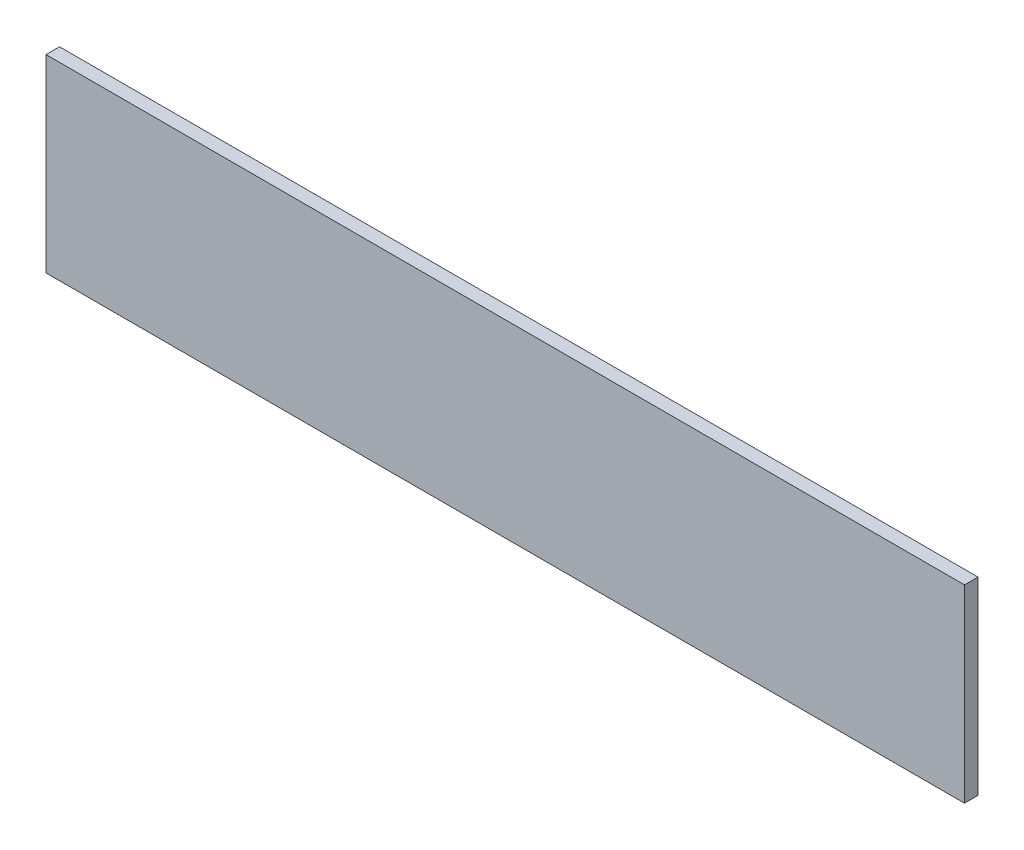
ISO-10303-21;
HEADER;
FILE_DESCRIPTION(('STEP AP214'),'2;1');
FILE_NAME('part.step','',(''),(''),'','','');
FILE_SCHEMA(('AUTOMOTIVE_DESIGN { 1 0 10303 214 1 1 1 1 }'));
ENDSEC;
DATA;
#1=APPLICATION_CONTEXT('core data for automotive mechanical design processes');
#2=APPLICATION_PROTOCOL_DEFINITION('international standard','automotive_design',2000,#1);
#3=PRODUCT_CONTEXT('',#1,'mechanical');
#4=PRODUCT('Part','Part','',(#3));
#5=PRODUCT_RELATED_PRODUCT_CATEGORY('part','',(#4));
#6=PRODUCT_DEFINITION_FORMATION('','',#4);
#7=PRODUCT_DEFINITION_CONTEXT('part definition',#1,'design');
#8=PRODUCT_DEFINITION('design','',#6,#7);
#9=PRODUCT_DEFINITION_SHAPE('','',#8);
#10=(LENGTH_UNIT() NAMED_UNIT(*) SI_UNIT(.MILLI.,.METRE.));
#11=(NAMED_UNIT(*) PLANE_ANGLE_UNIT() SI_UNIT($,.RADIAN.));
#12=(NAMED_UNIT(*) SI_UNIT($,.STERADIAN.) SOLID_ANGLE_UNIT());
#13=UNCERTAINTY_MEASURE_WITH_UNIT(LENGTH_MEASURE(1.E-05),#10,'distance_accuracy_value','');
#14=(GEOMETRIC_REPRESENTATION_CONTEXT(3) GLOBAL_UNCERTAINTY_ASSIGNED_CONTEXT((#13)) GLOBAL_UNIT_ASSIGNED_CONTEXT((#10,
#11,#12)) REPRESENTATION_CONTEXT('',''));
#15=CARTESIAN_POINT('',(0.,0.,0.));
#16=DIRECTION('',(0.,0.,1.));
#17=DIRECTION('',(1.,0.,0.));
#18=AXIS2_PLACEMENT_3D('',#15,#16,#17);
#19=CARTESIAN_POINT('',(0.,0.,0.));
#20=DIRECTION('',(0.,0.,-1.));
#21=DIRECTION('',(-1.,0.,0.));
#22=AXIS2_PLACEMENT_3D('',#19,#20,#21);
#23=PLANE('',#22);
#24=CARTESIAN_POINT('',(-319.0875,-82.55,0.));
#25=DIRECTION('',(0.,0.,-1.));
#26=DIRECTION('',(-1.,0.,0.));
#27=AXIS2_PLACEMENT_3D('',#24,#25,#26);
#28=CIRCLE('',#27,3.17499999999997);
#29=CARTESIAN_POINT('',(-322.2625,-82.55,0.));
#30=VERTEX_POINT('',#29);
#31=EDGE_CURVE('E195',#30,#30,#28,.T.);
#32=ORIENTED_EDGE('',*,*,#31,.F.);
#33=EDGE_LOOP('',(#32));
#34=FACE_BOUND('',#33,.T.);
#35=CARTESIAN_POINT('',(-106.3625,-82.55,0.));
#36=DIRECTION('',(0.,0.,-1.));
#37=DIRECTION('',(-1.,0.,0.));
#38=AXIS2_PLACEMENT_3D('',#35,#36,#37);
#39=CIRCLE('',#38,3.17499999999997);
#40=CARTESIAN_POINT('',(-109.5375,-82.55,0.));
#41=VERTEX_POINT('',#40);
#42=EDGE_CURVE('E189',#41,#41,#39,.T.);
#43=ORIENTED_EDGE('',*,*,#42,.F.);
#44=EDGE_LOOP('',(#43));
#45=FACE_BOUND('',#44,.T.);
#46=CARTESIAN_POINT('',(106.3625,-82.55,0.));
#47=DIRECTION('',(0.,0.,-1.));
#48=DIRECTION('',(-1.,0.,0.));
#49=AXIS2_PLACEMENT_3D('',#46,#47,#48);
#50=CIRCLE('',#49,3.17499999999997);
#51=CARTESIAN_POINT('',(103.1875,-82.55,0.));
#52=VERTEX_POINT('',#51);
#53=EDGE_CURVE('E183',#52,#52,#50,.T.);
#54=ORIENTED_EDGE('',*,*,#53,.F.);
#55=EDGE_LOOP('',(#54));
#56=FACE_BOUND('',#55,.T.);
#57=CARTESIAN_POINT('',(319.0875,-82.55,0.));
#58=DIRECTION('',(0.,0.,-1.));
#59=DIRECTION('',(-1.,0.,0.));
#60=AXIS2_PLACEMENT_3D('',#57,#58,#59);
#61=CIRCLE('',#60,3.17499999999997);
#62=CARTESIAN_POINT('',(315.9125,-82.55,0.));
#63=VERTEX_POINT('',#62);
#64=EDGE_CURVE('E177',#63,#63,#61,.T.);
#65=ORIENTED_EDGE('',*,*,#64,.F.);
#66=EDGE_LOOP('',(#65));
#67=FACE_BOUND('',#66,.T.);
#68=CARTESIAN_POINT('',(-425.45,-82.55,0.));
#69=DIRECTION('',(0.,0.,-1.));
#70=DIRECTION('',(-1.,0.,0.));
#71=AXIS2_PLACEMENT_3D('',#68,#69,#70);
#72=CIRCLE('',#71,2.50000000000002);
#73=CARTESIAN_POINT('',(-427.95,-82.55,0.));
#74=VERTEX_POINT('',#73);
#75=EDGE_CURVE('E171',#74,#74,#72,.T.);
#76=ORIENTED_EDGE('',*,*,#75,.F.);
#77=EDGE_LOOP('',(#76));
#78=FACE_BOUND('',#77,.T.);
#79=CARTESIAN_POINT('',(-212.725,-82.55,0.));
#80=DIRECTION('',(0.,0.,-1.));
#81=DIRECTION('',(-1.,0.,0.));
#82=AXIS2_PLACEMENT_3D('',#79,#80,#81);
#83=CIRCLE('',#82,2.50000000000002);
#84=CARTESIAN_POINT('',(-215.225,-82.55,0.));
#85=VERTEX_POINT('',#84);
#86=EDGE_CURVE('E165',#85,#85,#83,.T.);
#87=ORIENTED_EDGE('',*,*,#86,.F.);
#88=EDGE_LOOP('',(#87));
#89=FACE_BOUND('',#88,.T.);
#90=CARTESIAN_POINT('',(-1.66533453693773E-13,-82.55,0.));
#91=DIRECTION('',(0.,0.,-1.));
#92=DIRECTION('',(-1.,0.,0.));
#93=AXIS2_PLACEMENT_3D('',#90,#91,#92);
#94=CIRCLE('',#93,2.50000000000002);
#95=CARTESIAN_POINT('',(-2.50000000000019,-82.55,0.));
#96=VERTEX_POINT('',#95);
#97=EDGE_CURVE('E159',#96,#96,#94,.T.);
#98=ORIENTED_EDGE('',*,*,#97,.F.);
#99=EDGE_LOOP('',(#98));
#100=FACE_BOUND('',#99,.T.);
#101=CARTESIAN_POINT('',(212.725,-82.55,0.));
#102=DIRECTION('',(0.,0.,-1.));
#103=DIRECTION('',(-1.,0.,0.));
#104=AXIS2_PLACEMENT_3D('',#101,#102,#103);
#105=CIRCLE('',#104,2.50000000000002);
#106=CARTESIAN_POINT('',(210.225,-82.55,0.));
#107=VERTEX_POINT('',#106);
#108=EDGE_CURVE('E153',#107,#107,#105,.T.);
#109=ORIENTED_EDGE('',*,*,#108,.F.);
#110=EDGE_LOOP('',(#109));
#111=FACE_BOUND('',#110,.T.);
#112=CARTESIAN_POINT('',(425.45,-82.55,0.));
#113=DIRECTION('',(0.,0.,-1.));
#114=DIRECTION('',(-1.,0.,0.));
#115=AXIS2_PLACEMENT_3D('',#112,#113,#114);
#116=CIRCLE('',#115,2.50000000000002);
#117=CARTESIAN_POINT('',(422.95,-82.55,0.));
#118=VERTEX_POINT('',#117);
#119=EDGE_CURVE('E147',#118,#118,#116,.T.);
#120=ORIENTED_EDGE('',*,*,#119,.F.);
#121=EDGE_LOOP('',(#120));
#122=FACE_BOUND('',#121,.T.);
#123=CARTESIAN_POINT('',(425.45,-44.4499999999999,0.));
#124=DIRECTION('',(0.,0.,-1.));
#125=DIRECTION('',(1.,0.,0.));
#126=AXIS2_PLACEMENT_3D('',#123,#124,#125);
#127=CIRCLE('',#126,2.50000000000002);
#128=CARTESIAN_POINT('',(427.95,-44.4499999999999,0.));
#129=VERTEX_POINT('',#128);
#130=EDGE_CURVE('E141',#129,#129,#127,.T.);
#131=ORIENTED_EDGE('',*,*,#130,.F.);
#132=EDGE_LOOP('',(#131));
#133=FACE_BOUND('',#132,.T.);
#134=CARTESIAN_POINT('',(-425.45,-44.4499999999998,0.));
#135=DIRECTION('',(0.,0.,-1.));
#136=DIRECTION('',(-1.,0.,0.));
#137=AXIS2_PLACEMENT_3D('',#134,#135,#136);
#138=CIRCLE('',#137,2.50000000000002);
#139=CARTESIAN_POINT('',(-427.95,-44.4499999999998,0.));
#140=VERTEX_POINT('',#139);
#141=EDGE_CURVE('E135',#140,#140,#138,.T.);
#142=ORIENTED_EDGE('',*,*,#141,.F.);
#143=EDGE_LOOP('',(#142));
#144=FACE_BOUND('',#143,.T.);
#145=CARTESIAN_POINT('',(-425.45,44.4500000000001,0.));
#146=DIRECTION('',(0.,0.,-1.));
#147=DIRECTION('',(1.,0.,0.));
#148=AXIS2_PLACEMENT_3D('',#145,#146,#147);
#149=CIRCLE('',#148,2.50000000000002);
#150=CARTESIAN_POINT('',(-422.95,44.4500000000001,0.));
#151=VERTEX_POINT('',#150);
#152=EDGE_CURVE('E129',#151,#151,#149,.T.);
#153=ORIENTED_EDGE('',*,*,#152,.F.);
#154=EDGE_LOOP('',(#153));
#155=FACE_BOUND('',#154,.T.);
#156=CARTESIAN_POINT('',(425.45,44.4499999999999,0.));
#157=DIRECTION('',(0.,0.,-1.));
#158=DIRECTION('',(-1.,0.,0.));
#159=AXIS2_PLACEMENT_3D('',#156,#157,#158);
#160=CIRCLE('',#159,2.50000000000002);
#161=CARTESIAN_POINT('',(422.95,44.4499999999999,0.));
#162=VERTEX_POINT('',#161);
#163=EDGE_CURVE('E123',#162,#162,#160,.T.);
#164=ORIENTED_EDGE('',*,*,#163,.F.);
#165=EDGE_LOOP('',(#164));
#166=FACE_BOUND('',#165,.T.);
#167=CARTESIAN_POINT('',(-425.45,0.,0.));
#168=DIRECTION('',(0.,0.,1.));
#169=DIRECTION('',(1.,0.,0.));
#170=AXIS2_PLACEMENT_3D('',#167,#168,#169);
#171=CIRCLE('',#170,3.17499999999997);
#172=CARTESIAN_POINT('',(-422.275,0.,0.));
#173=VERTEX_POINT('',#172);
#174=EDGE_CURVE('E111',#173,#173,#171,.T.);
#175=ORIENTED_EDGE('',*,*,#174,.T.);
#176=EDGE_LOOP('',(#175));
#177=FACE_BOUND('',#176,.T.);
#178=DIRECTION('',(0.,1.,0.));
#179=VECTOR('',#178,1.);
#180=CARTESIAN_POINT('',(431.8,-88.9,0.));
#181=LINE('',#180,#179);
#182=CARTESIAN_POINT('',(431.8,-88.9,0.));
#183=VERTEX_POINT('',#182);
#184=CARTESIAN_POINT('',(431.8,88.9,0.));
#185=VERTEX_POINT('',#184);
#186=EDGE_CURVE('E97',#183,#185,#181,.T.);
#187=ORIENTED_EDGE('',*,*,#186,.F.);
#188=DIRECTION('',(1.,0.,0.));
#189=VECTOR('',#188,1.);
#190=CARTESIAN_POINT('',(-431.8,-88.9,0.));
#191=LINE('',#190,#189);
#192=CARTESIAN_POINT('',(-431.8,-88.9,0.));
#193=VERTEX_POINT('',#192);
#194=EDGE_CURVE('E73',#193,#183,#191,.T.);
#195=ORIENTED_EDGE('',*,*,#194,.F.);
#196=DIRECTION('',(0.,-1.,0.));
#197=VECTOR('',#196,1.);
#198=CARTESIAN_POINT('',(-431.8,-88.9,0.));
#199=LINE('',#198,#197);
#200=CARTESIAN_POINT('',(-431.8,88.9,0.));
#201=VERTEX_POINT('',#200);
#202=EDGE_CURVE('E67',#201,#193,#199,.T.);
#203=ORIENTED_EDGE('',*,*,#202,.F.);
#204=DIRECTION('',(-1.,0.,0.));
#205=VECTOR('',#204,1.);
#206=CARTESIAN_POINT('',(-431.8,88.9,0.));
#207=LINE('',#206,#205);
#208=EDGE_CURVE('E89',#185,#201,#207,.T.);
#209=ORIENTED_EDGE('',*,*,#208,.F.);
#210=EDGE_LOOP('',(#187,#195,#203,#209));
#211=FACE_BOUND('',#210,.T.);
#212=CARTESIAN_POINT('',(425.45,0.,0.));
#213=DIRECTION('',(0.,0.,1.));
#214=DIRECTION('',(-1.,0.,0.));
#215=AXIS2_PLACEMENT_3D('',#212,#213,#214);
#216=CIRCLE('',#215,3.17499999999997);
#217=CARTESIAN_POINT('',(422.275,0.,0.));
#218=VERTEX_POINT('',#217);
#219=EDGE_CURVE('E117',#218,#218,#216,.T.);
#220=ORIENTED_EDGE('',*,*,#219,.T.);
#221=EDGE_LOOP('',(#220));
#222=FACE_BOUND('',#221,.T.);
#223=ADVANCED_FACE('F33',(#34,#45,#56,#67,#78,#89,#100,#111,#122,#133,#144,#155,#166,#177,#211,
#222),#23,.T.);
#224=CARTESIAN_POINT('',(431.8,-88.9,12.7));
#225=DIRECTION('',(-1.,0.,0.));
#226=DIRECTION('',(0.,0.,1.));
#227=AXIS2_PLACEMENT_3D('',#224,#225,#226);
#228=PLANE('',#227);
#229=ORIENTED_EDGE('',*,*,#186,.T.);
#230=DIRECTION('',(0.,0.,-1.));
#231=VECTOR('',#230,1.);
#232=CARTESIAN_POINT('',(431.8,88.9,12.7));
#233=LINE('',#232,#231);
#234=CARTESIAN_POINT('',(431.8,88.9,12.7));
#235=VERTEX_POINT('',#234);
#236=EDGE_CURVE('E11',#235,#185,#233,.T.);
#237=ORIENTED_EDGE('',*,*,#236,.F.);
#238=DIRECTION('',(0.,1.,0.));
#239=VECTOR('',#238,1.);
#240=CARTESIAN_POINT('',(431.8,-88.9,12.7));
#241=LINE('',#240,#239);
#242=CARTESIAN_POINT('',(431.8,-88.9,12.7));
#243=VERTEX_POINT('',#242);
#244=EDGE_CURVE('E85',#243,#235,#241,.T.);
#245=ORIENTED_EDGE('',*,*,#244,.F.);
#246=DIRECTION('',(0.,0.,-1.));
#247=VECTOR('',#246,1.);
#248=CARTESIAN_POINT('',(431.8,-88.9,12.7));
#249=LINE('',#248,#247);
#250=EDGE_CURVE('E93',#243,#183,#249,.T.);
#251=ORIENTED_EDGE('',*,*,#250,.T.);
#252=EDGE_LOOP('',(#229,#237,#245,#251));
#253=FACE_BOUND('',#252,.T.);
#254=ADVANCED_FACE('F35',(#253),#228,.F.);
#255=CARTESIAN_POINT('',(-431.8,88.9,12.7));
#256=DIRECTION('',(0.,-1.,0.));
#257=DIRECTION('',(0.,0.,-1.));
#258=AXIS2_PLACEMENT_3D('',#255,#256,#257);
#259=PLANE('',#258);
#260=ORIENTED_EDGE('',*,*,#208,.T.);
#261=DIRECTION('',(0.,0.,-1.));
#262=VECTOR('',#261,1.);
#263=CARTESIAN_POINT('',(-431.8,88.9,12.7));
#264=LINE('',#263,#262);
#265=CARTESIAN_POINT('',(-431.8,88.9,12.7));
#266=VERTEX_POINT('',#265);
#267=EDGE_CURVE('E42',#266,#201,#264,.T.);
#268=ORIENTED_EDGE('',*,*,#267,.F.);
#269=DIRECTION('',(-1.,0.,0.));
#270=VECTOR('',#269,1.);
#271=CARTESIAN_POINT('',(-431.8,88.9,12.7));
#272=LINE('',#271,#270);
#273=EDGE_CURVE('E80',#235,#266,#272,.T.);
#274=ORIENTED_EDGE('',*,*,#273,.F.);
#275=ORIENTED_EDGE('',*,*,#236,.T.);
#276=EDGE_LOOP('',(#260,#268,#274,#275));
#277=FACE_BOUND('',#276,.T.);
#278=ADVANCED_FACE('F88',(#277),#259,.F.);
#279=CARTESIAN_POINT('',(-431.8,-88.9,12.7));
#280=DIRECTION('',(1.,0.,0.));
#281=DIRECTION('',(0.,0.,-1.));
#282=AXIS2_PLACEMENT_3D('',#279,#280,#281);
#283=PLANE('',#282);
#284=ORIENTED_EDGE('',*,*,#202,.T.);
#285=DIRECTION('',(0.,0.,-1.));
#286=VECTOR('',#285,1.);
#287=CARTESIAN_POINT('',(-431.8,-88.9,12.7));
#288=LINE('',#287,#286);
#289=CARTESIAN_POINT('',(-431.8,-88.9,12.7));
#290=VERTEX_POINT('',#289);
#291=EDGE_CURVE('E90',#290,#193,#288,.T.);
#292=ORIENTED_EDGE('',*,*,#291,.F.);
#293=DIRECTION('',(0.,-1.,0.));
#294=VECTOR('',#293,1.);
#295=CARTESIAN_POINT('',(-431.8,-88.9,12.7));
#296=LINE('',#295,#294);
#297=EDGE_CURVE('E83',#266,#290,#296,.T.);
#298=ORIENTED_EDGE('',*,*,#297,.F.);
#299=ORIENTED_EDGE('',*,*,#267,.T.);
#300=EDGE_LOOP('',(#284,#292,#298,#299));
#301=FACE_BOUND('',#300,.T.);
#302=ADVANCED_FACE('F91',(#301),#283,.F.);
#303=CARTESIAN_POINT('',(-431.8,-88.9,12.7));
#304=DIRECTION('',(0.,1.,0.));
#305=DIRECTION('',(0.,0.,1.));
#306=AXIS2_PLACEMENT_3D('',#303,#304,#305);
#307=PLANE('',#306);
#308=ORIENTED_EDGE('',*,*,#194,.T.);
#309=ORIENTED_EDGE('',*,*,#250,.F.);
#310=DIRECTION('',(1.,0.,0.));
#311=VECTOR('',#310,1.);
#312=CARTESIAN_POINT('',(-431.8,-88.9,12.7));
#313=LINE('',#312,#311);
#314=EDGE_CURVE('E50',#290,#243,#313,.T.);
#315=ORIENTED_EDGE('',*,*,#314,.F.);
#316=ORIENTED_EDGE('',*,*,#291,.T.);
#317=EDGE_LOOP('',(#308,#309,#315,#316));
#318=FACE_BOUND('',#317,.T.);
#319=ADVANCED_FACE('F105',(#318),#307,.F.);
#320=CARTESIAN_POINT('',(0.,0.,12.7));
#321=DIRECTION('',(0.,0.,-1.));
#322=DIRECTION('',(-1.,0.,0.));
#323=AXIS2_PLACEMENT_3D('',#320,#321,#322);
#324=PLANE('',#323);
#325=ORIENTED_EDGE('',*,*,#244,.T.);
#326=ORIENTED_EDGE('',*,*,#273,.T.);
#327=ORIENTED_EDGE('',*,*,#297,.T.);
#328=ORIENTED_EDGE('',*,*,#314,.T.);
#329=EDGE_LOOP('',(#325,#326,#327,#328));
#330=FACE_BOUND('',#329,.T.);
#331=ADVANCED_FACE('F81',(#330),#324,.F.);
#332=CARTESIAN_POINT('',(-425.45,0.,11.43));
#333=DIRECTION('',(0.,0.,-1.));
#334=DIRECTION('',(-1.,0.,0.));
#335=AXIS2_PLACEMENT_3D('',#332,#333,#334);
#336=CYLINDRICAL_SURFACE('',#335,3.17499999999997);
#337=CARTESIAN_POINT('',(-425.45,0.,11.43));
#338=DIRECTION('',(0.,0.,1.));
#339=DIRECTION('',(1.,0.,0.));
#340=AXIS2_PLACEMENT_3D('',#337,#338,#339);
#341=CIRCLE('',#340,3.17499999999997);
#342=CARTESIAN_POINT('',(-422.275,0.,11.43));
#343=VERTEX_POINT('',#342);
#344=EDGE_CURVE('E100',#343,#343,#341,.T.);
#345=ORIENTED_EDGE('',*,*,#344,.T.);
#346=EDGE_LOOP('',(#345));
#347=FACE_BOUND('',#346,.T.);
#348=ORIENTED_EDGE('',*,*,#174,.F.);
#349=EDGE_LOOP('',(#348));
#350=FACE_BOUND('',#349,.T.);
#351=ADVANCED_FACE('F239',(#347,#350),#336,.F.);
#352=CARTESIAN_POINT('',(-425.45,0.,11.43));
#353=DIRECTION('',(0.,0.,1.));
#354=DIRECTION('',(1.,0.,0.));
#355=AXIS2_PLACEMENT_3D('',#352,#353,#354);
#356=PLANE('',#355);
#357=ORIENTED_EDGE('',*,*,#344,.F.);
#358=EDGE_LOOP('',(#357));
#359=FACE_BOUND('',#358,.T.);
#360=ADVANCED_FACE('F241',(#359),#356,.F.);
#361=CARTESIAN_POINT('',(425.45,0.,11.43));
#362=DIRECTION('',(0.,0.,-1.));
#363=DIRECTION('',(-1.,0.,0.));
#364=AXIS2_PLACEMENT_3D('',#361,#362,#363);
#365=CYLINDRICAL_SURFACE('',#364,3.17499999999997);
#366=CARTESIAN_POINT('',(425.45,0.,11.43));
#367=DIRECTION('',(0.,0.,1.));
#368=DIRECTION('',(-1.,0.,0.));
#369=AXIS2_PLACEMENT_3D('',#366,#367,#368);
#370=CIRCLE('',#369,3.17499999999997);
#371=CARTESIAN_POINT('',(422.275,0.,11.43));
#372=VERTEX_POINT('',#371);
#373=EDGE_CURVE('E114',#372,#372,#370,.T.);
#374=ORIENTED_EDGE('',*,*,#373,.T.);
#375=EDGE_LOOP('',(#374));
#376=FACE_BOUND('',#375,.T.);
#377=ORIENTED_EDGE('',*,*,#219,.F.);
#378=EDGE_LOOP('',(#377));
#379=FACE_BOUND('',#378,.T.);
#380=ADVANCED_FACE('F248',(#376,#379),#365,.F.);
#381=CARTESIAN_POINT('',(425.45,0.,11.43));
#382=DIRECTION('',(0.,0.,-1.));
#383=DIRECTION('',(-1.,0.,0.));
#384=AXIS2_PLACEMENT_3D('',#381,#382,#383);
#385=PLANE('',#384);
#386=ORIENTED_EDGE('',*,*,#373,.F.);
#387=EDGE_LOOP('',(#386));
#388=FACE_BOUND('',#387,.T.);
#389=ADVANCED_FACE('F422',(#388),#385,.T.);
#390=CARTESIAN_POINT('',(425.45,44.4499999999999,8.));
#391=DIRECTION('',(0.,0.,-1.));
#392=DIRECTION('',(-1.,0.,0.));
#393=AXIS2_PLACEMENT_3D('',#390,#391,#392);
#394=CYLINDRICAL_SURFACE('',#393,2.50000000000002);
#395=CARTESIAN_POINT('',(425.45,44.4499999999999,8.));
#396=DIRECTION('',(0.,0.,-1.));
#397=DIRECTION('',(-1.,0.,0.));
#398=AXIS2_PLACEMENT_3D('',#395,#396,#397);
#399=CIRCLE('',#398,2.50000000000002);
#400=CARTESIAN_POINT('',(422.95,44.4499999999999,8.));
#401=VERTEX_POINT('',#400);
#402=EDGE_CURVE('E120',#401,#401,#399,.T.);
#403=ORIENTED_EDGE('',*,*,#402,.F.);
#404=EDGE_LOOP('',(#403));
#405=FACE_BOUND('',#404,.T.);
#406=ORIENTED_EDGE('',*,*,#163,.T.);
#407=EDGE_LOOP('',(#406));
#408=FACE_BOUND('',#407,.T.);
#409=ADVANCED_FACE('F418',(#405,#408),#394,.F.);
#410=CARTESIAN_POINT('',(425.45,44.4499999999999,8.));
#411=DIRECTION('',(0.,0.,-1.));
#412=DIRECTION('',(-1.,0.,0.));
#413=AXIS2_PLACEMENT_3D('',#410,#411,#412);
#414=PLANE('',#413);
#415=ORIENTED_EDGE('',*,*,#402,.T.);
#416=EDGE_LOOP('',(#415));
#417=FACE_BOUND('',#416,.T.);
#418=ADVANCED_FACE('F414',(#417),#414,.T.);
#419=CARTESIAN_POINT('',(-425.45,44.4500000000001,8.));
#420=DIRECTION('',(0.,0.,-1.));
#421=DIRECTION('',(-1.,0.,0.));
#422=AXIS2_PLACEMENT_3D('',#419,#420,#421);
#423=CYLINDRICAL_SURFACE('',#422,2.50000000000002);
#424=CARTESIAN_POINT('',(-425.45,44.4500000000001,8.));
#425=DIRECTION('',(0.,0.,-1.));
#426=DIRECTION('',(1.,0.,0.));
#427=AXIS2_PLACEMENT_3D('',#424,#425,#426);
#428=CIRCLE('',#427,2.50000000000002);
#429=CARTESIAN_POINT('',(-422.95,44.4500000000001,8.));
#430=VERTEX_POINT('',#429);
#431=EDGE_CURVE('E126',#430,#430,#428,.T.);
#432=ORIENTED_EDGE('',*,*,#431,.F.);
#433=EDGE_LOOP('',(#432));
#434=FACE_BOUND('',#433,.T.);
#435=ORIENTED_EDGE('',*,*,#152,.T.);
#436=EDGE_LOOP('',(#435));
#437=FACE_BOUND('',#436,.T.);
#438=ADVANCED_FACE('F410',(#434,#437),#423,.F.);
#439=CARTESIAN_POINT('',(-425.45,44.4500000000001,8.));
#440=DIRECTION('',(0.,0.,1.));
#441=DIRECTION('',(1.,0.,0.));
#442=AXIS2_PLACEMENT_3D('',#439,#440,#441);
#443=PLANE('',#442);
#444=ORIENTED_EDGE('',*,*,#431,.T.);
#445=EDGE_LOOP('',(#444));
#446=FACE_BOUND('',#445,.T.);
#447=ADVANCED_FACE('F406',(#446),#443,.F.);
#448=CARTESIAN_POINT('',(-425.45,-44.4499999999998,8.));
#449=DIRECTION('',(0.,0.,-1.));
#450=DIRECTION('',(-1.,0.,0.));
#451=AXIS2_PLACEMENT_3D('',#448,#449,#450);
#452=CYLINDRICAL_SURFACE('',#451,2.50000000000002);
#453=CARTESIAN_POINT('',(-425.45,-44.4499999999998,8.));
#454=DIRECTION('',(0.,0.,-1.));
#455=DIRECTION('',(-1.,0.,0.));
#456=AXIS2_PLACEMENT_3D('',#453,#454,#455);
#457=CIRCLE('',#456,2.50000000000002);
#458=CARTESIAN_POINT('',(-427.95,-44.4499999999998,8.));
#459=VERTEX_POINT('',#458);
#460=EDGE_CURVE('E132',#459,#459,#457,.T.);
#461=ORIENTED_EDGE('',*,*,#460,.F.);
#462=EDGE_LOOP('',(#461));
#463=FACE_BOUND('',#462,.T.);
#464=ORIENTED_EDGE('',*,*,#141,.T.);
#465=EDGE_LOOP('',(#464));
#466=FACE_BOUND('',#465,.T.);
#467=ADVANCED_FACE('F402',(#463,#466),#452,.F.);
#468=CARTESIAN_POINT('',(-425.45,-44.4499999999998,8.));
#469=DIRECTION('',(0.,0.,-1.));
#470=DIRECTION('',(-1.,0.,0.));
#471=AXIS2_PLACEMENT_3D('',#468,#469,#470);
#472=PLANE('',#471);
#473=ORIENTED_EDGE('',*,*,#460,.T.);
#474=EDGE_LOOP('',(#473));
#475=FACE_BOUND('',#474,.T.);
#476=ADVANCED_FACE('F398',(#475),#472,.T.);
#477=CARTESIAN_POINT('',(425.45,-44.4499999999999,8.));
#478=DIRECTION('',(0.,0.,-1.));
#479=DIRECTION('',(-1.,0.,0.));
#480=AXIS2_PLACEMENT_3D('',#477,#478,#479);
#481=CYLINDRICAL_SURFACE('',#480,2.50000000000002);
#482=CARTESIAN_POINT('',(425.45,-44.4499999999999,8.));
#483=DIRECTION('',(0.,0.,-1.));
#484=DIRECTION('',(1.,0.,0.));
#485=AXIS2_PLACEMENT_3D('',#482,#483,#484);
#486=CIRCLE('',#485,2.50000000000002);
#487=CARTESIAN_POINT('',(427.95,-44.4499999999999,8.));
#488=VERTEX_POINT('',#487);
#489=EDGE_CURVE('E138',#488,#488,#486,.T.);
#490=ORIENTED_EDGE('',*,*,#489,.F.);
#491=EDGE_LOOP('',(#490));
#492=FACE_BOUND('',#491,.T.);
#493=ORIENTED_EDGE('',*,*,#130,.T.);
#494=EDGE_LOOP('',(#493));
#495=FACE_BOUND('',#494,.T.);
#496=ADVANCED_FACE('F394',(#492,#495),#481,.F.);
#497=CARTESIAN_POINT('',(425.45,-44.4499999999999,8.));
#498=DIRECTION('',(0.,0.,1.));
#499=DIRECTION('',(1.,0.,0.));
#500=AXIS2_PLACEMENT_3D('',#497,#498,#499);
#501=PLANE('',#500);
#502=ORIENTED_EDGE('',*,*,#489,.T.);
#503=EDGE_LOOP('',(#502));
#504=FACE_BOUND('',#503,.T.);
#505=ADVANCED_FACE('F390',(#504),#501,.F.);
#506=CARTESIAN_POINT('',(425.45,-82.55,8.));
#507=DIRECTION('',(0.,0.,-1.));
#508=DIRECTION('',(-1.,0.,0.));
#509=AXIS2_PLACEMENT_3D('',#506,#507,#508);
#510=CYLINDRICAL_SURFACE('',#509,2.50000000000002);
#511=CARTESIAN_POINT('',(425.45,-82.55,8.));
#512=DIRECTION('',(0.,0.,-1.));
#513=DIRECTION('',(-1.,0.,0.));
#514=AXIS2_PLACEMENT_3D('',#511,#512,#513);
#515=CIRCLE('',#514,2.50000000000002);
#516=CARTESIAN_POINT('',(422.95,-82.55,8.));
#517=VERTEX_POINT('',#516);
#518=EDGE_CURVE('E144',#517,#517,#515,.T.);
#519=ORIENTED_EDGE('',*,*,#518,.F.);
#520=EDGE_LOOP('',(#519));
#521=FACE_BOUND('',#520,.T.);
#522=ORIENTED_EDGE('',*,*,#119,.T.);
#523=EDGE_LOOP('',(#522));
#524=FACE_BOUND('',#523,.T.);
#525=ADVANCED_FACE('F386',(#521,#524),#510,.F.);
#526=CARTESIAN_POINT('',(425.45,-82.55,8.));
#527=DIRECTION('',(0.,0.,-1.));
#528=DIRECTION('',(-1.,0.,0.));
#529=AXIS2_PLACEMENT_3D('',#526,#527,#528);
#530=PLANE('',#529);
#531=ORIENTED_EDGE('',*,*,#518,.T.);
#532=EDGE_LOOP('',(#531));
#533=FACE_BOUND('',#532,.T.);
#534=ADVANCED_FACE('F382',(#533),#530,.T.);
#535=CARTESIAN_POINT('',(212.725,-82.55,8.));
#536=DIRECTION('',(0.,0.,-1.));
#537=DIRECTION('',(-1.,0.,0.));
#538=AXIS2_PLACEMENT_3D('',#535,#536,#537);
#539=CYLINDRICAL_SURFACE('',#538,2.50000000000002);
#540=CARTESIAN_POINT('',(212.725,-82.55,8.));
#541=DIRECTION('',(0.,0.,-1.));
#542=DIRECTION('',(-1.,0.,0.));
#543=AXIS2_PLACEMENT_3D('',#540,#541,#542);
#544=CIRCLE('',#543,2.50000000000002);
#545=CARTESIAN_POINT('',(210.225,-82.55,8.));
#546=VERTEX_POINT('',#545);
#547=EDGE_CURVE('E150',#546,#546,#544,.T.);
#548=ORIENTED_EDGE('',*,*,#547,.F.);
#549=EDGE_LOOP('',(#548));
#550=FACE_BOUND('',#549,.T.);
#551=ORIENTED_EDGE('',*,*,#108,.T.);
#552=EDGE_LOOP('',(#551));
#553=FACE_BOUND('',#552,.T.);
#554=ADVANCED_FACE('F378',(#550,#553),#539,.F.);
#555=CARTESIAN_POINT('',(212.725,-82.55,8.));
#556=DIRECTION('',(0.,0.,-1.));
#557=DIRECTION('',(-1.,0.,0.));
#558=AXIS2_PLACEMENT_3D('',#555,#556,#557);
#559=PLANE('',#558);
#560=ORIENTED_EDGE('',*,*,#547,.T.);
#561=EDGE_LOOP('',(#560));
#562=FACE_BOUND('',#561,.T.);
#563=ADVANCED_FACE('F374',(#562),#559,.T.);
#564=CARTESIAN_POINT('',(-1.66533453693773E-13,-82.55,8.));
#565=DIRECTION('',(0.,0.,-1.));
#566=DIRECTION('',(-1.,0.,0.));
#567=AXIS2_PLACEMENT_3D('',#564,#565,#566);
#568=CYLINDRICAL_SURFACE('',#567,2.50000000000002);
#569=CARTESIAN_POINT('',(-1.66533453693773E-13,-82.55,8.));
#570=DIRECTION('',(0.,0.,-1.));
#571=DIRECTION('',(-1.,0.,0.));
#572=AXIS2_PLACEMENT_3D('',#569,#570,#571);
#573=CIRCLE('',#572,2.50000000000002);
#574=CARTESIAN_POINT('',(-2.50000000000019,-82.55,8.));
#575=VERTEX_POINT('',#574);
#576=EDGE_CURVE('E156',#575,#575,#573,.T.);
#577=ORIENTED_EDGE('',*,*,#576,.F.);
#578=EDGE_LOOP('',(#577));
#579=FACE_BOUND('',#578,.T.);
#580=ORIENTED_EDGE('',*,*,#97,.T.);
#581=EDGE_LOOP('',(#580));
#582=FACE_BOUND('',#581,.T.);
#583=ADVANCED_FACE('F370',(#579,#582),#568,.F.);
#584=CARTESIAN_POINT('',(-1.66533453693773E-13,-82.55,8.));
#585=DIRECTION('',(0.,0.,-1.));
#586=DIRECTION('',(-1.,0.,0.));
#587=AXIS2_PLACEMENT_3D('',#584,#585,#586);
#588=PLANE('',#587);
#589=ORIENTED_EDGE('',*,*,#576,.T.);
#590=EDGE_LOOP('',(#589));
#591=FACE_BOUND('',#590,.T.);
#592=ADVANCED_FACE('F366',(#591),#588,.T.);
#593=CARTESIAN_POINT('',(-212.725,-82.55,8.));
#594=DIRECTION('',(0.,0.,-1.));
#595=DIRECTION('',(-1.,0.,0.));
#596=AXIS2_PLACEMENT_3D('',#593,#594,#595);
#597=CYLINDRICAL_SURFACE('',#596,2.50000000000002);
#598=CARTESIAN_POINT('',(-212.725,-82.55,8.));
#599=DIRECTION('',(0.,0.,-1.));
#600=DIRECTION('',(-1.,0.,0.));
#601=AXIS2_PLACEMENT_3D('',#598,#599,#600);
#602=CIRCLE('',#601,2.50000000000002);
#603=CARTESIAN_POINT('',(-215.225,-82.55,8.));
#604=VERTEX_POINT('',#603);
#605=EDGE_CURVE('E162',#604,#604,#602,.T.);
#606=ORIENTED_EDGE('',*,*,#605,.F.);
#607=EDGE_LOOP('',(#606));
#608=FACE_BOUND('',#607,.T.);
#609=ORIENTED_EDGE('',*,*,#86,.T.);
#610=EDGE_LOOP('',(#609));
#611=FACE_BOUND('',#610,.T.);
#612=ADVANCED_FACE('F362',(#608,#611),#597,.F.);
#613=CARTESIAN_POINT('',(-212.725,-82.55,8.));
#614=DIRECTION('',(0.,0.,-1.));
#615=DIRECTION('',(-1.,0.,0.));
#616=AXIS2_PLACEMENT_3D('',#613,#614,#615);
#617=PLANE('',#616);
#618=ORIENTED_EDGE('',*,*,#605,.T.);
#619=EDGE_LOOP('',(#618));
#620=FACE_BOUND('',#619,.T.);
#621=ADVANCED_FACE('F358',(#620),#617,.T.);
#622=CARTESIAN_POINT('',(-425.45,-82.55,8.));
#623=DIRECTION('',(0.,0.,-1.));
#624=DIRECTION('',(-1.,0.,0.));
#625=AXIS2_PLACEMENT_3D('',#622,#623,#624);
#626=CYLINDRICAL_SURFACE('',#625,2.50000000000002);
#627=CARTESIAN_POINT('',(-425.45,-82.55,8.));
#628=DIRECTION('',(0.,0.,-1.));
#629=DIRECTION('',(-1.,0.,0.));
#630=AXIS2_PLACEMENT_3D('',#627,#628,#629);
#631=CIRCLE('',#630,2.50000000000002);
#632=CARTESIAN_POINT('',(-427.95,-82.55,8.));
#633=VERTEX_POINT('',#632);
#634=EDGE_CURVE('E168',#633,#633,#631,.T.);
#635=ORIENTED_EDGE('',*,*,#634,.F.);
#636=EDGE_LOOP('',(#635));
#637=FACE_BOUND('',#636,.T.);
#638=ORIENTED_EDGE('',*,*,#75,.T.);
#639=EDGE_LOOP('',(#638));
#640=FACE_BOUND('',#639,.T.);
#641=ADVANCED_FACE('F354',(#637,#640),#626,.F.);
#642=CARTESIAN_POINT('',(-425.45,-82.55,8.));
#643=DIRECTION('',(0.,0.,-1.));
#644=DIRECTION('',(-1.,0.,0.));
#645=AXIS2_PLACEMENT_3D('',#642,#643,#644);
#646=PLANE('',#645);
#647=ORIENTED_EDGE('',*,*,#634,.T.);
#648=EDGE_LOOP('',(#647));
#649=FACE_BOUND('',#648,.T.);
#650=ADVANCED_FACE('F275',(#649),#646,.T.);
#651=CARTESIAN_POINT('',(319.0875,-82.55,11.43));
#652=DIRECTION('',(0.,0.,-1.));
#653=DIRECTION('',(-1.,0.,0.));
#654=AXIS2_PLACEMENT_3D('',#651,#652,#653);
#655=CYLINDRICAL_SURFACE('',#654,3.17499999999997);
#656=CARTESIAN_POINT('',(319.0875,-82.55,11.43));
#657=DIRECTION('',(0.,0.,-1.));
#658=DIRECTION('',(-1.,0.,0.));
#659=AXIS2_PLACEMENT_3D('',#656,#657,#658);
#660=CIRCLE('',#659,3.17499999999997);
#661=CARTESIAN_POINT('',(315.9125,-82.55,11.43));
#662=VERTEX_POINT('',#661);
#663=EDGE_CURVE('E174',#662,#662,#660,.T.);
#664=ORIENTED_EDGE('',*,*,#663,.F.);
#665=EDGE_LOOP('',(#664));
#666=FACE_BOUND('',#665,.T.);
#667=ORIENTED_EDGE('',*,*,#64,.T.);
#668=EDGE_LOOP('',(#667));
#669=FACE_BOUND('',#668,.T.);
#670=ADVANCED_FACE('F280',(#666,#669),#655,.F.);
#671=CARTESIAN_POINT('',(319.0875,-82.55,11.43));
#672=DIRECTION('',(0.,0.,-1.));
#673=DIRECTION('',(-1.,0.,0.));
#674=AXIS2_PLACEMENT_3D('',#671,#672,#673);
#675=PLANE('',#674);
#676=ORIENTED_EDGE('',*,*,#663,.T.);
#677=EDGE_LOOP('',(#676));
#678=FACE_BOUND('',#677,.T.);
#679=ADVANCED_FACE('F285',(#678),#675,.T.);
#680=CARTESIAN_POINT('',(106.3625,-82.55,11.43));
#681=DIRECTION('',(0.,0.,-1.));
#682=DIRECTION('',(-1.,0.,0.));
#683=AXIS2_PLACEMENT_3D('',#680,#681,#682);
#684=CYLINDRICAL_SURFACE('',#683,3.17499999999997);
#685=CARTESIAN_POINT('',(106.3625,-82.55,11.43));
#686=DIRECTION('',(0.,0.,-1.));
#687=DIRECTION('',(-1.,0.,0.));
#688=AXIS2_PLACEMENT_3D('',#685,#686,#687);
#689=CIRCLE('',#688,3.17499999999997);
#690=CARTESIAN_POINT('',(103.1875,-82.55,11.43));
#691=VERTEX_POINT('',#690);
#692=EDGE_CURVE('E180',#691,#691,#689,.T.);
#693=ORIENTED_EDGE('',*,*,#692,.F.);
#694=EDGE_LOOP('',(#693));
#695=FACE_BOUND('',#694,.T.);
#696=ORIENTED_EDGE('',*,*,#53,.T.);
#697=EDGE_LOOP('',(#696));
#698=FACE_BOUND('',#697,.T.);
#699=ADVANCED_FACE('F295',(#695,#698),#684,.F.);
#700=CARTESIAN_POINT('',(106.3625,-82.55,11.43));
#701=DIRECTION('',(0.,0.,-1.));
#702=DIRECTION('',(-1.,0.,0.));
#703=AXIS2_PLACEMENT_3D('',#700,#701,#702);
#704=PLANE('',#703);
#705=ORIENTED_EDGE('',*,*,#692,.T.);
#706=EDGE_LOOP('',(#705));
#707=FACE_BOUND('',#706,.T.);
#708=ADVANCED_FACE('F305',(#707),#704,.T.);
#709=CARTESIAN_POINT('',(-106.3625,-82.55,11.43));
#710=DIRECTION('',(0.,0.,-1.));
#711=DIRECTION('',(-1.,0.,0.));
#712=AXIS2_PLACEMENT_3D('',#709,#710,#711);
#713=CYLINDRICAL_SURFACE('',#712,3.17499999999997);
#714=CARTESIAN_POINT('',(-106.3625,-82.55,11.43));
#715=DIRECTION('',(0.,0.,-1.));
#716=DIRECTION('',(-1.,0.,0.));
#717=AXIS2_PLACEMENT_3D('',#714,#715,#716);
#718=CIRCLE('',#717,3.17499999999997);
#719=CARTESIAN_POINT('',(-109.5375,-82.55,11.43));
#720=VERTEX_POINT('',#719);
#721=EDGE_CURVE('E186',#720,#720,#718,.T.);
#722=ORIENTED_EDGE('',*,*,#721,.F.);
#723=EDGE_LOOP('',(#722));
#724=FACE_BOUND('',#723,.T.);
#725=ORIENTED_EDGE('',*,*,#42,.T.);
#726=EDGE_LOOP('',(#725));
#727=FACE_BOUND('',#726,.T.);
#728=ADVANCED_FACE('F315',(#724,#727),#713,.F.);
#729=CARTESIAN_POINT('',(-106.3625,-82.55,11.43));
#730=DIRECTION('',(0.,0.,-1.));
#731=DIRECTION('',(-1.,0.,0.));
#732=AXIS2_PLACEMENT_3D('',#729,#730,#731);
#733=PLANE('',#732);
#734=ORIENTED_EDGE('',*,*,#721,.T.);
#735=EDGE_LOOP('',(#734));
#736=FACE_BOUND('',#735,.T.);
#737=ADVANCED_FACE('F206',(#736),#733,.T.);
#738=CARTESIAN_POINT('',(-319.0875,-82.55,11.43));
#739=DIRECTION('',(0.,0.,-1.));
#740=DIRECTION('',(-1.,0.,0.));
#741=AXIS2_PLACEMENT_3D('',#738,#739,#740);
#742=CYLINDRICAL_SURFACE('',#741,3.17499999999997);
#743=CARTESIAN_POINT('',(-319.0875,-82.55,11.43));
#744=DIRECTION('',(0.,0.,-1.));
#745=DIRECTION('',(-1.,0.,0.));
#746=AXIS2_PLACEMENT_3D('',#743,#744,#745);
#747=CIRCLE('',#746,3.17499999999997);
#748=CARTESIAN_POINT('',(-322.2625,-82.55,11.43));
#749=VERTEX_POINT('',#748);
#750=EDGE_CURVE('E192',#749,#749,#747,.T.);
#751=ORIENTED_EDGE('',*,*,#750,.F.);
#752=EDGE_LOOP('',(#751));
#753=FACE_BOUND('',#752,.T.);
#754=ORIENTED_EDGE('',*,*,#31,.T.);
#755=EDGE_LOOP('',(#754));
#756=FACE_BOUND('',#755,.T.);
#757=ADVANCED_FACE('F203',(#753,#756),#742,.F.);
#758=CARTESIAN_POINT('',(-319.0875,-82.55,11.43));
#759=DIRECTION('',(0.,0.,-1.));
#760=DIRECTION('',(-1.,0.,0.));
#761=AXIS2_PLACEMENT_3D('',#758,#759,#760);
#762=PLANE('',#761);
#763=ORIENTED_EDGE('',*,*,#750,.T.);
#764=EDGE_LOOP('',(#763));
#765=FACE_BOUND('',#764,.T.);
#766=ADVANCED_FACE('F201',(#765),#762,.T.);
#767=CLOSED_SHELL('',(#223,#254,#278,#302,#319,#331,#351,#360,#380,#389,#409,#418,#438,#447,
#467,#476,#496,#505,#525,#534,#554,#563,#583,#592,#612,#621,#641,#650,#670,#679,#699,#708,#728,
#737,#757,#766));
#768=MANIFOLD_SOLID_BREP('B2',#767);
#769=ADVANCED_BREP_SHAPE_REPRESENTATION('',(#18,#768),#14);
#770=SHAPE_DEFINITION_REPRESENTATION(#9,#769);
ENDSEC;
END-ISO-10303-21;
